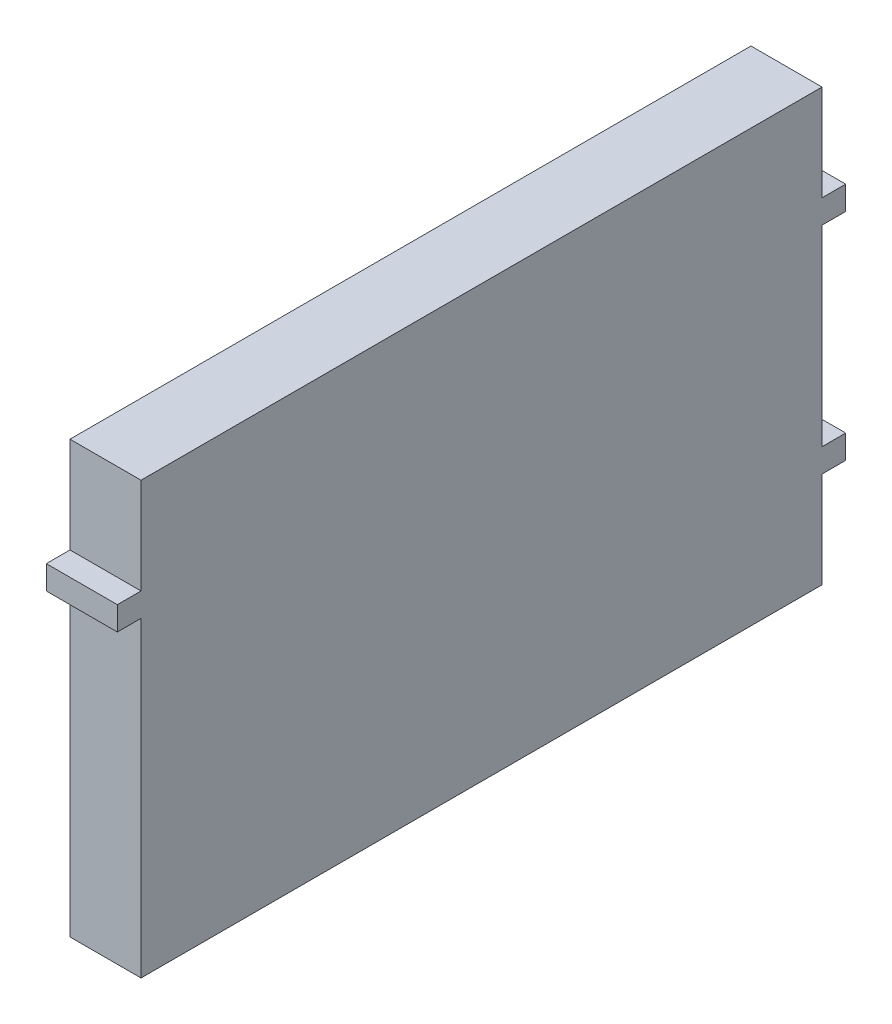
ISO-10303-21;
HEADER;
FILE_DESCRIPTION(('STEP AP214'),'2;1');
FILE_NAME('part.step','',(''),(''),'','','');
FILE_SCHEMA(('AUTOMOTIVE_DESIGN { 1 0 10303 214 1 1 1 1 }'));
ENDSEC;
DATA;
#1=APPLICATION_CONTEXT('core data for automotive mechanical design processes');
#2=APPLICATION_PROTOCOL_DEFINITION('international standard','automotive_design',2000,#1);
#3=PRODUCT_CONTEXT('',#1,'mechanical');
#4=PRODUCT('Part','Part','',(#3));
#5=PRODUCT_RELATED_PRODUCT_CATEGORY('part','',(#4));
#6=PRODUCT_DEFINITION_FORMATION('','',#4);
#7=PRODUCT_DEFINITION_CONTEXT('part definition',#1,'design');
#8=PRODUCT_DEFINITION('design','',#6,#7);
#9=PRODUCT_DEFINITION_SHAPE('','',#8);
#10=(LENGTH_UNIT() NAMED_UNIT(*) SI_UNIT(.MILLI.,.METRE.));
#11=(NAMED_UNIT(*) PLANE_ANGLE_UNIT() SI_UNIT($,.RADIAN.));
#12=(NAMED_UNIT(*) SI_UNIT($,.STERADIAN.) SOLID_ANGLE_UNIT());
#13=UNCERTAINTY_MEASURE_WITH_UNIT(LENGTH_MEASURE(1.E-05),#10,'distance_accuracy_value','');
#14=(GEOMETRIC_REPRESENTATION_CONTEXT(3) GLOBAL_UNCERTAINTY_ASSIGNED_CONTEXT((#13)) GLOBAL_UNIT_ASSIGNED_CONTEXT((#10,
#11,#12)) REPRESENTATION_CONTEXT('',''));
#15=CARTESIAN_POINT('',(0.,0.,0.));
#16=DIRECTION('',(0.,0.,1.));
#17=DIRECTION('',(1.,0.,0.));
#18=AXIS2_PLACEMENT_3D('',#15,#16,#17);
#19=CARTESIAN_POINT('',(365.992991784874,377.766708454733,-776.88119407791));
#20=DIRECTION('',(0.,0.,1.));
#21=DIRECTION('',(-1.,0.,0.));
#22=AXIS2_PLACEMENT_3D('',#19,#20,#21);
#23=PLANE('',#22);
#24=DIRECTION('',(0.,-1.,0.));
#25=VECTOR('',#24,1.);
#26=CARTESIAN_POINT('',(252.542706630704,377.766708454733,-776.88119407791));
#27=LINE('',#26,#25);
#28=CARTESIAN_POINT('',(252.542706630704,377.766708454733,-776.88119407791));
#29=VERTEX_POINT('',#28);
#30=CARTESIAN_POINT('',(252.542706630704,374.591708454733,-776.88119407791));
#31=VERTEX_POINT('',#30);
#32=EDGE_CURVE('E209',#29,#31,#27,.T.);
#33=ORIENTED_EDGE('',*,*,#32,.T.);
#34=DIRECTION('',(-1.,0.,0.));
#35=VECTOR('',#34,1.);
#36=CARTESIAN_POINT('',(365.992991784874,374.591708454733,-776.88119407791));
#37=LINE('',#36,#35);
#38=CARTESIAN_POINT('',(243.017706630704,374.591708454733,-776.88119407791));
#39=VERTEX_POINT('',#38);
#40=EDGE_CURVE('E213',#31,#39,#37,.T.);
#41=ORIENTED_EDGE('',*,*,#40,.T.);
#42=DIRECTION('',(0.,-1.,0.));
#43=VECTOR('',#42,1.);
#44=CARTESIAN_POINT('',(243.017706630704,377.766708454733,-776.88119407791));
#45=LINE('',#44,#43);
#46=CARTESIAN_POINT('',(243.017706630704,377.766708454733,-776.88119407791));
#47=VERTEX_POINT('',#46);
#48=EDGE_CURVE('E216',#47,#39,#45,.T.);
#49=ORIENTED_EDGE('',*,*,#48,.F.);
#50=DIRECTION('',(-1.,0.,0.));
#51=VECTOR('',#50,1.);
#52=CARTESIAN_POINT('',(365.992991784874,377.766708454733,-776.88119407791));
#53=LINE('',#52,#51);
#54=EDGE_CURVE('E39',#29,#47,#53,.T.);
#55=ORIENTED_EDGE('',*,*,#54,.F.);
#56=EDGE_LOOP('',(#33,#41,#49,#55));
#57=FACE_BOUND('',#56,.T.);
#58=ADVANCED_FACE('F35',(#57),#23,.F.);
#59=CARTESIAN_POINT('',(365.992991784874,374.591708454733,-776.88119407791));
#60=DIRECTION('',(0.,1.,0.));
#61=DIRECTION('',(-1.,0.,0.));
#62=AXIS2_PLACEMENT_3D('',#59,#60,#61);
#63=PLANE('',#62);
#64=DIRECTION('',(0.,0.,1.));
#65=VECTOR('',#64,1.);
#66=CARTESIAN_POINT('',(252.542706630704,374.591708454733,-776.88119407791));
#67=LINE('',#66,#65);
#68=CARTESIAN_POINT('',(252.542706630704,374.591708454733,-773.70619407791));
#69=VERTEX_POINT('',#68);
#70=EDGE_CURVE('E132',#31,#69,#67,.T.);
#71=ORIENTED_EDGE('',*,*,#70,.T.);
#72=DIRECTION('',(-1.,0.,0.));
#73=VECTOR('',#72,1.);
#74=CARTESIAN_POINT('',(365.992991784874,374.591708454733,-773.70619407791));
#75=LINE('',#74,#73);
#76=CARTESIAN_POINT('',(243.017706630704,374.591708454733,-773.70619407791));
#77=VERTEX_POINT('',#76);
#78=EDGE_CURVE('E217',#69,#77,#75,.T.);
#79=ORIENTED_EDGE('',*,*,#78,.T.);
#80=DIRECTION('',(0.,0.,1.));
#81=VECTOR('',#80,1.);
#82=CARTESIAN_POINT('',(243.017706630704,374.591708454733,-776.88119407791));
#83=LINE('',#82,#81);
#84=EDGE_CURVE('E123',#39,#77,#83,.T.);
#85=ORIENTED_EDGE('',*,*,#84,.F.);
#86=ORIENTED_EDGE('',*,*,#40,.F.);
#87=EDGE_LOOP('',(#71,#79,#85,#86));
#88=FACE_BOUND('',#87,.T.);
#89=ADVANCED_FACE('F291',(#88),#63,.F.);
#90=CARTESIAN_POINT('',(365.992991784874,361.732958454733,-773.70619407791));
#91=DIRECTION('',(0.,0.,1.));
#92=DIRECTION('',(-1.,0.,0.));
#93=AXIS2_PLACEMENT_3D('',#90,#91,#92);
#94=PLANE('',#93);
#95=DIRECTION('',(0.,-1.,0.));
#96=VECTOR('',#95,1.);
#97=CARTESIAN_POINT('',(252.542706630704,361.732958454733,-773.70619407791));
#98=LINE('',#97,#96);
#99=CARTESIAN_POINT('',(252.542706630704,361.732958454733,-773.70619407791));
#100=VERTEX_POINT('',#99);
#101=EDGE_CURVE('E205',#69,#100,#98,.T.);
#102=ORIENTED_EDGE('',*,*,#101,.T.);
#103=DIRECTION('',(-1.,0.,0.));
#104=VECTOR('',#103,1.);
#105=CARTESIAN_POINT('',(365.992991784874,361.732958454733,-773.70619407791));
#106=LINE('',#105,#104);
#107=CARTESIAN_POINT('',(243.017706630704,361.732958454733,-773.70619407791));
#108=VERTEX_POINT('',#107);
#109=EDGE_CURVE('E220',#100,#108,#106,.T.);
#110=ORIENTED_EDGE('',*,*,#109,.T.);
#111=DIRECTION('',(0.,-1.,0.));
#112=VECTOR('',#111,1.);
#113=CARTESIAN_POINT('',(243.017706630704,361.732958454733,-773.70619407791));
#114=LINE('',#113,#112);
#115=EDGE_CURVE('E219',#77,#108,#114,.T.);
#116=ORIENTED_EDGE('',*,*,#115,.F.);
#117=ORIENTED_EDGE('',*,*,#78,.F.);
#118=EDGE_LOOP('',(#102,#110,#116,#117));
#119=FACE_BOUND('',#118,.T.);
#120=ADVANCED_FACE('F294',(#119),#94,.F.);
#121=CARTESIAN_POINT('',(365.992991784874,361.732958454733,-682.42494407791));
#122=DIRECTION('',(0.,1.,0.));
#123=DIRECTION('',(-1.,0.,0.));
#124=AXIS2_PLACEMENT_3D('',#121,#122,#123);
#125=PLANE('',#124);
#126=DIRECTION('',(0.,0.,1.));
#127=VECTOR('',#126,1.);
#128=CARTESIAN_POINT('',(252.542706630704,361.732958454733,-682.42494407791));
#129=LINE('',#128,#127);
#130=CARTESIAN_POINT('',(252.542706630704,361.732958454733,-682.42494407791));
#131=VERTEX_POINT('',#130);
#132=EDGE_CURVE('E202',#100,#131,#129,.T.);
#133=ORIENTED_EDGE('',*,*,#132,.T.);
#134=DIRECTION('',(-1.,0.,0.));
#135=VECTOR('',#134,1.);
#136=CARTESIAN_POINT('',(365.992991784874,361.732958454733,-682.42494407791));
#137=LINE('',#136,#135);
#138=CARTESIAN_POINT('',(243.017706630704,361.732958454733,-682.42494407791));
#139=VERTEX_POINT('',#138);
#140=EDGE_CURVE('E224',#131,#139,#137,.T.);
#141=ORIENTED_EDGE('',*,*,#140,.T.);
#142=DIRECTION('',(0.,0.,1.));
#143=VECTOR('',#142,1.);
#144=CARTESIAN_POINT('',(243.017706630704,361.732958454733,-682.42494407791));
#145=LINE('',#144,#143);
#146=EDGE_CURVE('E223',#108,#139,#145,.T.);
#147=ORIENTED_EDGE('',*,*,#146,.F.);
#148=ORIENTED_EDGE('',*,*,#109,.F.);
#149=EDGE_LOOP('',(#133,#141,#147,#148));
#150=FACE_BOUND('',#149,.T.);
#151=ADVANCED_FACE('F312',(#150),#125,.F.);
#152=CARTESIAN_POINT('',(365.992991784874,403.484208454733,-682.42494407791));
#153=DIRECTION('',(0.,0.,-1.));
#154=DIRECTION('',(1.,0.,0.));
#155=AXIS2_PLACEMENT_3D('',#152,#153,#154);
#156=PLANE('',#155);
#157=DIRECTION('',(0.,1.,0.));
#158=VECTOR('',#157,1.);
#159=CARTESIAN_POINT('',(252.542706630704,403.484208454733,-682.42494407791));
#160=LINE('',#159,#158);
#161=CARTESIAN_POINT('',(252.542706630704,403.484208454733,-682.42494407791));
#162=VERTEX_POINT('',#161);
#163=EDGE_CURVE('E199',#131,#162,#160,.T.);
#164=ORIENTED_EDGE('',*,*,#163,.T.);
#165=DIRECTION('',(-1.,0.,0.));
#166=VECTOR('',#165,1.);
#167=CARTESIAN_POINT('',(365.992991784874,403.484208454733,-682.42494407791));
#168=LINE('',#167,#166);
#169=CARTESIAN_POINT('',(243.017706630704,403.484208454733,-682.42494407791));
#170=VERTEX_POINT('',#169);
#171=EDGE_CURVE('E228',#162,#170,#168,.T.);
#172=ORIENTED_EDGE('',*,*,#171,.T.);
#173=DIRECTION('',(0.,1.,0.));
#174=VECTOR('',#173,1.);
#175=CARTESIAN_POINT('',(243.017706630704,403.484208454733,-682.42494407791));
#176=LINE('',#175,#174);
#177=EDGE_CURVE('E227',#139,#170,#176,.T.);
#178=ORIENTED_EDGE('',*,*,#177,.F.);
#179=ORIENTED_EDGE('',*,*,#140,.F.);
#180=EDGE_LOOP('',(#164,#172,#178,#179));
#181=FACE_BOUND('',#180,.T.);
#182=ADVANCED_FACE('F315',(#181),#156,.F.);
#183=CARTESIAN_POINT('',(365.992991784874,403.484208454733,-682.42494407791));
#184=DIRECTION('',(0.,1.,0.));
#185=DIRECTION('',(-1.,0.,0.));
#186=AXIS2_PLACEMENT_3D('',#183,#184,#185);
#187=PLANE('',#186);
#188=DIRECTION('',(0.,0.,1.));
#189=VECTOR('',#188,1.);
#190=CARTESIAN_POINT('',(252.542706630704,403.484208454733,-682.42494407791));
#191=LINE('',#190,#189);
#192=CARTESIAN_POINT('',(252.542706630704,403.484208454733,-679.24994407791));
#193=VERTEX_POINT('',#192);
#194=EDGE_CURVE('E196',#162,#193,#191,.T.);
#195=ORIENTED_EDGE('',*,*,#194,.T.);
#196=DIRECTION('',(-1.,0.,0.));
#197=VECTOR('',#196,1.);
#198=CARTESIAN_POINT('',(365.992991784874,403.484208454733,-679.24994407791));
#199=LINE('',#198,#197);
#200=CARTESIAN_POINT('',(243.017706630704,403.484208454733,-679.24994407791));
#201=VERTEX_POINT('',#200);
#202=EDGE_CURVE('E232',#193,#201,#199,.T.);
#203=ORIENTED_EDGE('',*,*,#202,.T.);
#204=DIRECTION('',(0.,0.,1.));
#205=VECTOR('',#204,1.);
#206=CARTESIAN_POINT('',(243.017706630704,403.484208454733,-682.42494407791));
#207=LINE('',#206,#205);
#208=EDGE_CURVE('E231',#170,#201,#207,.T.);
#209=ORIENTED_EDGE('',*,*,#208,.F.);
#210=ORIENTED_EDGE('',*,*,#171,.F.);
#211=EDGE_LOOP('',(#195,#203,#209,#210));
#212=FACE_BOUND('',#211,.T.);
#213=ADVANCED_FACE('F319',(#212),#187,.F.);
#214=CARTESIAN_POINT('',(365.992991784874,403.484208454733,-679.24994407791));
#215=DIRECTION('',(0.,0.,-1.));
#216=DIRECTION('',(1.,0.,0.));
#217=AXIS2_PLACEMENT_3D('',#214,#215,#216);
#218=PLANE('',#217);
#219=DIRECTION('',(0.,1.,0.));
#220=VECTOR('',#219,1.);
#221=CARTESIAN_POINT('',(252.542706630704,403.484208454733,-679.24994407791));
#222=LINE('',#221,#220);
#223=CARTESIAN_POINT('',(252.542706630704,406.659208454733,-679.24994407791));
#224=VERTEX_POINT('',#223);
#225=EDGE_CURVE('E193',#193,#224,#222,.T.);
#226=ORIENTED_EDGE('',*,*,#225,.T.);
#227=DIRECTION('',(-1.,0.,0.));
#228=VECTOR('',#227,1.);
#229=CARTESIAN_POINT('',(365.992991784874,406.659208454733,-679.24994407791));
#230=LINE('',#229,#228);
#231=CARTESIAN_POINT('',(243.017706630704,406.659208454733,-679.24994407791));
#232=VERTEX_POINT('',#231);
#233=EDGE_CURVE('E236',#224,#232,#230,.T.);
#234=ORIENTED_EDGE('',*,*,#233,.T.);
#235=DIRECTION('',(0.,1.,0.));
#236=VECTOR('',#235,1.);
#237=CARTESIAN_POINT('',(243.017706630704,403.484208454733,-679.24994407791));
#238=LINE('',#237,#236);
#239=EDGE_CURVE('E235',#201,#232,#238,.T.);
#240=ORIENTED_EDGE('',*,*,#239,.F.);
#241=ORIENTED_EDGE('',*,*,#202,.F.);
#242=EDGE_LOOP('',(#226,#234,#240,#241));
#243=FACE_BOUND('',#242,.T.);
#244=ADVANCED_FACE('F323',(#243),#218,.F.);
#245=CARTESIAN_POINT('',(365.992991784874,406.659208454733,-679.24994407791));
#246=DIRECTION('',(0.,-1.,0.));
#247=DIRECTION('',(1.,0.,0.));
#248=AXIS2_PLACEMENT_3D('',#245,#246,#247);
#249=PLANE('',#248);
#250=DIRECTION('',(0.,0.,-1.));
#251=VECTOR('',#250,1.);
#252=CARTESIAN_POINT('',(252.542706630704,406.659208454733,-679.24994407791));
#253=LINE('',#252,#251);
#254=CARTESIAN_POINT('',(252.542706630704,406.659208454733,-682.42494407791));
#255=VERTEX_POINT('',#254);
#256=EDGE_CURVE('E190',#224,#255,#253,.T.);
#257=ORIENTED_EDGE('',*,*,#256,.T.);
#258=DIRECTION('',(-1.,0.,0.));
#259=VECTOR('',#258,1.);
#260=CARTESIAN_POINT('',(365.992991784874,406.659208454733,-682.42494407791));
#261=LINE('',#260,#259);
#262=CARTESIAN_POINT('',(243.017706630704,406.659208454733,-682.42494407791));
#263=VERTEX_POINT('',#262);
#264=EDGE_CURVE('E240',#255,#263,#261,.T.);
#265=ORIENTED_EDGE('',*,*,#264,.T.);
#266=DIRECTION('',(0.,0.,-1.));
#267=VECTOR('',#266,1.);
#268=CARTESIAN_POINT('',(243.017706630704,406.659208454733,-679.24994407791));
#269=LINE('',#268,#267);
#270=EDGE_CURVE('E239',#232,#263,#269,.T.);
#271=ORIENTED_EDGE('',*,*,#270,.F.);
#272=ORIENTED_EDGE('',*,*,#233,.F.);
#273=EDGE_LOOP('',(#257,#265,#271,#272));
#274=FACE_BOUND('',#273,.T.);
#275=ADVANCED_FACE('F327',(#274),#249,.F.);
#276=CARTESIAN_POINT('',(365.992991784874,419.517958454733,-682.42494407791));
#277=DIRECTION('',(0.,0.,-1.));
#278=DIRECTION('',(1.,0.,0.));
#279=AXIS2_PLACEMENT_3D('',#276,#277,#278);
#280=PLANE('',#279);
#281=DIRECTION('',(0.,1.,0.));
#282=VECTOR('',#281,1.);
#283=CARTESIAN_POINT('',(252.542706630704,419.517958454733,-682.42494407791));
#284=LINE('',#283,#282);
#285=CARTESIAN_POINT('',(252.542706630704,419.517958454733,-682.42494407791));
#286=VERTEX_POINT('',#285);
#287=EDGE_CURVE('E187',#255,#286,#284,.T.);
#288=ORIENTED_EDGE('',*,*,#287,.T.);
#289=DIRECTION('',(-1.,0.,0.));
#290=VECTOR('',#289,1.);
#291=CARTESIAN_POINT('',(365.992991784874,419.517958454733,-682.42494407791));
#292=LINE('',#291,#290);
#293=CARTESIAN_POINT('',(243.017706630704,419.517958454733,-682.42494407791));
#294=VERTEX_POINT('',#293);
#295=EDGE_CURVE('E244',#286,#294,#292,.T.);
#296=ORIENTED_EDGE('',*,*,#295,.T.);
#297=DIRECTION('',(0.,1.,0.));
#298=VECTOR('',#297,1.);
#299=CARTESIAN_POINT('',(243.017706630704,419.517958454733,-682.42494407791));
#300=LINE('',#299,#298);
#301=EDGE_CURVE('E243',#263,#294,#300,.T.);
#302=ORIENTED_EDGE('',*,*,#301,.F.);
#303=ORIENTED_EDGE('',*,*,#264,.F.);
#304=EDGE_LOOP('',(#288,#296,#302,#303));
#305=FACE_BOUND('',#304,.T.);
#306=ADVANCED_FACE('F331',(#305),#280,.F.);
#307=CARTESIAN_POINT('',(365.992991784874,419.517958454733,-773.70619407791));
#308=DIRECTION('',(0.,-1.,0.));
#309=DIRECTION('',(1.,0.,0.));
#310=AXIS2_PLACEMENT_3D('',#307,#308,#309);
#311=PLANE('',#310);
#312=DIRECTION('',(0.,0.,-1.));
#313=VECTOR('',#312,1.);
#314=CARTESIAN_POINT('',(252.542706630704,419.517958454733,-773.70619407791));
#315=LINE('',#314,#313);
#316=CARTESIAN_POINT('',(252.542706630704,419.517958454733,-773.70619407791));
#317=VERTEX_POINT('',#316);
#318=EDGE_CURVE('E184',#286,#317,#315,.T.);
#319=ORIENTED_EDGE('',*,*,#318,.T.);
#320=DIRECTION('',(-1.,0.,0.));
#321=VECTOR('',#320,1.);
#322=CARTESIAN_POINT('',(365.992991784874,419.517958454733,-773.70619407791));
#323=LINE('',#322,#321);
#324=CARTESIAN_POINT('',(243.017706630704,419.517958454733,-773.70619407791));
#325=VERTEX_POINT('',#324);
#326=EDGE_CURVE('E248',#317,#325,#323,.T.);
#327=ORIENTED_EDGE('',*,*,#326,.T.);
#328=DIRECTION('',(0.,0.,-1.));
#329=VECTOR('',#328,1.);
#330=CARTESIAN_POINT('',(243.017706630704,419.517958454733,-773.70619407791));
#331=LINE('',#330,#329);
#332=EDGE_CURVE('E247',#294,#325,#331,.T.);
#333=ORIENTED_EDGE('',*,*,#332,.F.);
#334=ORIENTED_EDGE('',*,*,#295,.F.);
#335=EDGE_LOOP('',(#319,#327,#333,#334));
#336=FACE_BOUND('',#335,.T.);
#337=ADVANCED_FACE('F335',(#336),#311,.F.);
#338=CARTESIAN_POINT('',(365.992991784874,406.659208454733,-773.70619407791));
#339=DIRECTION('',(0.,0.,1.));
#340=DIRECTION('',(-1.,0.,0.));
#341=AXIS2_PLACEMENT_3D('',#338,#339,#340);
#342=PLANE('',#341);
#343=DIRECTION('',(0.,-1.,0.));
#344=VECTOR('',#343,1.);
#345=CARTESIAN_POINT('',(252.542706630704,406.659208454733,-773.70619407791));
#346=LINE('',#345,#344);
#347=CARTESIAN_POINT('',(252.542706630704,406.659208454733,-773.70619407791));
#348=VERTEX_POINT('',#347);
#349=EDGE_CURVE('E181',#317,#348,#346,.T.);
#350=ORIENTED_EDGE('',*,*,#349,.T.);
#351=DIRECTION('',(-1.,0.,0.));
#352=VECTOR('',#351,1.);
#353=CARTESIAN_POINT('',(365.992991784874,406.659208454733,-773.70619407791));
#354=LINE('',#353,#352);
#355=CARTESIAN_POINT('',(243.017706630704,406.659208454733,-773.70619407791));
#356=VERTEX_POINT('',#355);
#357=EDGE_CURVE('E252',#348,#356,#354,.T.);
#358=ORIENTED_EDGE('',*,*,#357,.T.);
#359=DIRECTION('',(0.,-1.,0.));
#360=VECTOR('',#359,1.);
#361=CARTESIAN_POINT('',(243.017706630704,406.659208454733,-773.70619407791));
#362=LINE('',#361,#360);
#363=EDGE_CURVE('E251',#325,#356,#362,.T.);
#364=ORIENTED_EDGE('',*,*,#363,.F.);
#365=ORIENTED_EDGE('',*,*,#326,.F.);
#366=EDGE_LOOP('',(#350,#358,#364,#365));
#367=FACE_BOUND('',#366,.T.);
#368=ADVANCED_FACE('F339',(#367),#342,.F.);
#369=CARTESIAN_POINT('',(365.992991784874,406.659208454733,-773.70619407791));
#370=DIRECTION('',(0.,-1.,0.));
#371=DIRECTION('',(1.,0.,0.));
#372=AXIS2_PLACEMENT_3D('',#369,#370,#371);
#373=PLANE('',#372);
#374=DIRECTION('',(0.,0.,-1.));
#375=VECTOR('',#374,1.);
#376=CARTESIAN_POINT('',(252.542706630704,406.659208454733,-773.70619407791));
#377=LINE('',#376,#375);
#378=CARTESIAN_POINT('',(252.542706630704,406.659208454733,-776.88119407791));
#379=VERTEX_POINT('',#378);
#380=EDGE_CURVE('E175',#348,#379,#377,.T.);
#381=ORIENTED_EDGE('',*,*,#380,.T.);
#382=DIRECTION('',(-1.,0.,0.));
#383=VECTOR('',#382,1.);
#384=CARTESIAN_POINT('',(365.992991784874,406.659208454733,-776.88119407791));
#385=LINE('',#384,#383);
#386=CARTESIAN_POINT('',(243.017706630704,406.659208454733,-776.88119407791));
#387=VERTEX_POINT('',#386);
#388=EDGE_CURVE('E256',#379,#387,#385,.T.);
#389=ORIENTED_EDGE('',*,*,#388,.T.);
#390=DIRECTION('',(0.,0.,-1.));
#391=VECTOR('',#390,1.);
#392=CARTESIAN_POINT('',(243.017706630704,406.659208454733,-773.70619407791));
#393=LINE('',#392,#391);
#394=EDGE_CURVE('E255',#356,#387,#393,.T.);
#395=ORIENTED_EDGE('',*,*,#394,.F.);
#396=ORIENTED_EDGE('',*,*,#357,.F.);
#397=EDGE_LOOP('',(#381,#389,#395,#396));
#398=FACE_BOUND('',#397,.T.);
#399=ADVANCED_FACE('F343',(#398),#373,.F.);
#400=CARTESIAN_POINT('',(365.992991784874,406.659208454733,-776.88119407791));
#401=DIRECTION('',(0.,0.,1.));
#402=DIRECTION('',(-1.,0.,0.));
#403=AXIS2_PLACEMENT_3D('',#400,#401,#402);
#404=PLANE('',#403);
#405=DIRECTION('',(0.,-1.,0.));
#406=VECTOR('',#405,1.);
#407=CARTESIAN_POINT('',(252.542706630704,406.659208454733,-776.88119407791));
#408=LINE('',#407,#406);
#409=CARTESIAN_POINT('',(252.542706630704,403.484208454733,-776.88119407791));
#410=VERTEX_POINT('',#409);
#411=EDGE_CURVE('E173',#379,#410,#408,.T.);
#412=ORIENTED_EDGE('',*,*,#411,.T.);
#413=DIRECTION('',(-1.,0.,0.));
#414=VECTOR('',#413,1.);
#415=CARTESIAN_POINT('',(365.992991784874,403.484208454733,-776.88119407791));
#416=LINE('',#415,#414);
#417=CARTESIAN_POINT('',(243.017706630704,403.484208454733,-776.88119407791));
#418=VERTEX_POINT('',#417);
#419=EDGE_CURVE('E171',#410,#418,#416,.T.);
#420=ORIENTED_EDGE('',*,*,#419,.T.);
#421=DIRECTION('',(0.,-1.,0.));
#422=VECTOR('',#421,1.);
#423=CARTESIAN_POINT('',(243.017706630704,406.659208454733,-776.88119407791));
#424=LINE('',#423,#422);
#425=EDGE_CURVE('E259',#387,#418,#424,.T.);
#426=ORIENTED_EDGE('',*,*,#425,.F.);
#427=ORIENTED_EDGE('',*,*,#388,.F.);
#428=EDGE_LOOP('',(#412,#420,#426,#427));
#429=FACE_BOUND('',#428,.T.);
#430=ADVANCED_FACE('F347',(#429),#404,.F.);
#431=CARTESIAN_POINT('',(365.992991784874,403.484208454733,-776.88119407791));
#432=DIRECTION('',(0.,1.,0.));
#433=DIRECTION('',(-1.,0.,0.));
#434=AXIS2_PLACEMENT_3D('',#431,#432,#433);
#435=PLANE('',#434);
#436=DIRECTION('',(0.,0.,1.));
#437=VECTOR('',#436,1.);
#438=CARTESIAN_POINT('',(252.542706630704,403.484208454733,-776.88119407791));
#439=LINE('',#438,#437);
#440=CARTESIAN_POINT('',(252.542706630704,403.484208454733,-773.70619407791));
#441=VERTEX_POINT('',#440);
#442=EDGE_CURVE('E44',#410,#441,#439,.T.);
#443=ORIENTED_EDGE('',*,*,#442,.T.);
#444=DIRECTION('',(-1.,0.,0.));
#445=VECTOR('',#444,1.);
#446=CARTESIAN_POINT('',(365.992991784874,403.484208454733,-773.70619407791));
#447=LINE('',#446,#445);
#448=CARTESIAN_POINT('',(243.017706630704,403.484208454733,-773.70619407791));
#449=VERTEX_POINT('',#448);
#450=EDGE_CURVE('E162',#441,#449,#447,.T.);
#451=ORIENTED_EDGE('',*,*,#450,.T.);
#452=DIRECTION('',(0.,0.,1.));
#453=VECTOR('',#452,1.);
#454=CARTESIAN_POINT('',(243.017706630704,403.484208454733,-776.88119407791));
#455=LINE('',#454,#453);
#456=EDGE_CURVE('E167',#418,#449,#455,.T.);
#457=ORIENTED_EDGE('',*,*,#456,.F.);
#458=ORIENTED_EDGE('',*,*,#419,.F.);
#459=EDGE_LOOP('',(#443,#451,#457,#458));
#460=FACE_BOUND('',#459,.T.);
#461=ADVANCED_FACE('F169',(#460),#435,.F.);
#462=CARTESIAN_POINT('',(365.992991784874,377.766708454733,-773.70619407791));
#463=DIRECTION('',(0.,0.,1.));
#464=DIRECTION('',(-1.,0.,0.));
#465=AXIS2_PLACEMENT_3D('',#462,#463,#464);
#466=PLANE('',#465);
#467=DIRECTION('',(0.,-1.,0.));
#468=VECTOR('',#467,1.);
#469=CARTESIAN_POINT('',(252.542706630704,377.766708454733,-773.70619407791));
#470=LINE('',#469,#468);
#471=CARTESIAN_POINT('',(252.542706630704,377.766708454733,-773.70619407791));
#472=VERTEX_POINT('',#471);
#473=EDGE_CURVE('E11',#441,#472,#470,.T.);
#474=ORIENTED_EDGE('',*,*,#473,.T.);
#475=DIRECTION('',(-1.,0.,0.));
#476=VECTOR('',#475,1.);
#477=CARTESIAN_POINT('',(365.992991784874,377.766708454733,-773.70619407791));
#478=LINE('',#477,#476);
#479=CARTESIAN_POINT('',(243.017706630704,377.766708454733,-773.70619407791));
#480=VERTEX_POINT('',#479);
#481=EDGE_CURVE('E260',#472,#480,#478,.T.);
#482=ORIENTED_EDGE('',*,*,#481,.T.);
#483=DIRECTION('',(0.,-1.,0.));
#484=VECTOR('',#483,1.);
#485=CARTESIAN_POINT('',(243.017706630704,377.766708454733,-773.70619407791));
#486=LINE('',#485,#484);
#487=EDGE_CURVE('E164',#449,#480,#486,.T.);
#488=ORIENTED_EDGE('',*,*,#487,.F.);
#489=ORIENTED_EDGE('',*,*,#450,.F.);
#490=EDGE_LOOP('',(#474,#482,#488,#489));
#491=FACE_BOUND('',#490,.T.);
#492=ADVANCED_FACE('F163',(#491),#466,.F.);
#493=CARTESIAN_POINT('',(365.992991784874,377.766708454733,-773.70619407791));
#494=DIRECTION('',(0.,-1.,0.));
#495=DIRECTION('',(1.,0.,0.));
#496=AXIS2_PLACEMENT_3D('',#493,#494,#495);
#497=PLANE('',#496);
#498=DIRECTION('',(0.,0.,-1.));
#499=VECTOR('',#498,1.);
#500=CARTESIAN_POINT('',(252.542706630704,377.766708454733,-773.70619407791));
#501=LINE('',#500,#499);
#502=EDGE_CURVE('E52',#472,#29,#501,.T.);
#503=ORIENTED_EDGE('',*,*,#502,.T.);
#504=ORIENTED_EDGE('',*,*,#54,.T.);
#505=DIRECTION('',(0.,0.,-1.));
#506=VECTOR('',#505,1.);
#507=CARTESIAN_POINT('',(243.017706630704,377.766708454733,-773.70619407791));
#508=LINE('',#507,#506);
#509=EDGE_CURVE('E58',#480,#47,#508,.T.);
#510=ORIENTED_EDGE('',*,*,#509,.F.);
#511=ORIENTED_EDGE('',*,*,#481,.F.);
#512=EDGE_LOOP('',(#503,#504,#510,#511));
#513=FACE_BOUND('',#512,.T.);
#514=ADVANCED_FACE('F289',(#513),#497,.F.);
#515=CARTESIAN_POINT('',(243.017706630704,0.,0.));
#516=DIRECTION('',(1.,0.,0.));
#517=DIRECTION('',(0.,0.,1.));
#518=AXIS2_PLACEMENT_3D('',#515,#516,#517);
#519=PLANE('',#518);
#520=ORIENTED_EDGE('',*,*,#48,.T.);
#521=ORIENTED_EDGE('',*,*,#84,.T.);
#522=ORIENTED_EDGE('',*,*,#115,.T.);
#523=ORIENTED_EDGE('',*,*,#146,.T.);
#524=ORIENTED_EDGE('',*,*,#177,.T.);
#525=ORIENTED_EDGE('',*,*,#208,.T.);
#526=ORIENTED_EDGE('',*,*,#239,.T.);
#527=ORIENTED_EDGE('',*,*,#270,.T.);
#528=ORIENTED_EDGE('',*,*,#301,.T.);
#529=ORIENTED_EDGE('',*,*,#332,.T.);
#530=ORIENTED_EDGE('',*,*,#363,.T.);
#531=ORIENTED_EDGE('',*,*,#394,.T.);
#532=ORIENTED_EDGE('',*,*,#425,.T.);
#533=ORIENTED_EDGE('',*,*,#456,.T.);
#534=ORIENTED_EDGE('',*,*,#487,.T.);
#535=ORIENTED_EDGE('',*,*,#509,.T.);
#536=EDGE_LOOP('',(#520,#521,#522,#523,#524,#525,#526,#527,#528,#529,#530,#531,#532,#533,#534,#535));
#537=FACE_BOUND('',#536,.T.);
#538=ADVANCED_FACE('F296',(#537),#519,.F.);
#539=CARTESIAN_POINT('',(252.542706630704,403.484208454733,-776.88119407791));
#540=DIRECTION('',(1.,0.,0.));
#541=DIRECTION('',(0.,0.,1.));
#542=AXIS2_PLACEMENT_3D('',#539,#540,#541);
#543=PLANE('',#542);
#544=ORIENTED_EDGE('',*,*,#502,.F.);
#545=ORIENTED_EDGE('',*,*,#473,.F.);
#546=ORIENTED_EDGE('',*,*,#442,.F.);
#547=ORIENTED_EDGE('',*,*,#411,.F.);
#548=ORIENTED_EDGE('',*,*,#380,.F.);
#549=ORIENTED_EDGE('',*,*,#349,.F.);
#550=ORIENTED_EDGE('',*,*,#318,.F.);
#551=ORIENTED_EDGE('',*,*,#287,.F.);
#552=ORIENTED_EDGE('',*,*,#256,.F.);
#553=ORIENTED_EDGE('',*,*,#225,.F.);
#554=ORIENTED_EDGE('',*,*,#194,.F.);
#555=ORIENTED_EDGE('',*,*,#163,.F.);
#556=ORIENTED_EDGE('',*,*,#132,.F.);
#557=ORIENTED_EDGE('',*,*,#101,.F.);
#558=ORIENTED_EDGE('',*,*,#70,.F.);
#559=ORIENTED_EDGE('',*,*,#32,.F.);
#560=EDGE_LOOP('',(#544,#545,#546,#547,#548,#549,#550,#551,#552,#553,#554,#555,#556,#557,#558,#559));
#561=FACE_BOUND('',#560,.T.);
#562=ADVANCED_FACE('F37',(#561),#543,.T.);
#563=CLOSED_SHELL('',(#58,#89,#120,#151,#182,#213,#244,#275,#306,#337,#368,#399,#430,#461,#492,
#514,#538,#562));
#564=MANIFOLD_SOLID_BREP('B2',#563);
#565=ADVANCED_BREP_SHAPE_REPRESENTATION('',(#18,#564),#14);
#566=SHAPE_DEFINITION_REPRESENTATION(#9,#565);
ENDSEC;
END-ISO-10303-21;
